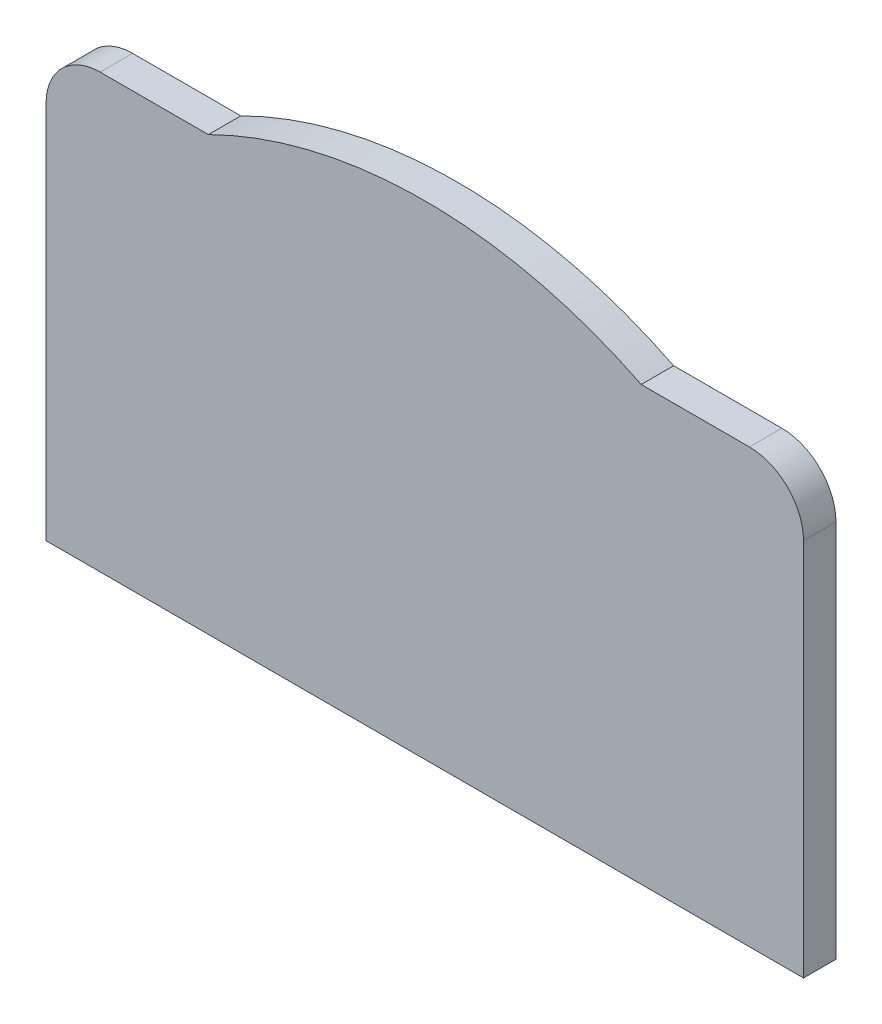
ISO-10303-21;
HEADER;
FILE_DESCRIPTION(('STEP AP214'),'2;1');
FILE_NAME('part.step','',(''),(''),'','','');
FILE_SCHEMA(('AUTOMOTIVE_DESIGN { 1 0 10303 214 1 1 1 1 }'));
ENDSEC;
DATA;
#1=APPLICATION_CONTEXT('core data for automotive mechanical design processes');
#2=APPLICATION_PROTOCOL_DEFINITION('international standard','automotive_design',2000,#1);
#3=PRODUCT_CONTEXT('',#1,'mechanical');
#4=PRODUCT('Part','Part','',(#3));
#5=PRODUCT_RELATED_PRODUCT_CATEGORY('part','',(#4));
#6=PRODUCT_DEFINITION_FORMATION('','',#4);
#7=PRODUCT_DEFINITION_CONTEXT('part definition',#1,'design');
#8=PRODUCT_DEFINITION('design','',#6,#7);
#9=PRODUCT_DEFINITION_SHAPE('','',#8);
#10=(LENGTH_UNIT() NAMED_UNIT(*) SI_UNIT(.MILLI.,.METRE.));
#11=(NAMED_UNIT(*) PLANE_ANGLE_UNIT() SI_UNIT($,.RADIAN.));
#12=(NAMED_UNIT(*) SI_UNIT($,.STERADIAN.) SOLID_ANGLE_UNIT());
#13=UNCERTAINTY_MEASURE_WITH_UNIT(LENGTH_MEASURE(1.E-05),#10,'distance_accuracy_value','');
#14=(GEOMETRIC_REPRESENTATION_CONTEXT(3) GLOBAL_UNCERTAINTY_ASSIGNED_CONTEXT((#13)) GLOBAL_UNIT_ASSIGNED_CONTEXT((#10,
#11,#12)) REPRESENTATION_CONTEXT('',''));
#15=CARTESIAN_POINT('',(0.,0.,0.));
#16=DIRECTION('',(0.,0.,1.));
#17=DIRECTION('',(1.,0.,0.));
#18=AXIS2_PLACEMENT_3D('',#15,#16,#17);
#19=CARTESIAN_POINT('',(-60.,40.,6.));
#20=DIRECTION('',(0.,-1.,0.));
#21=DIRECTION('',(0.,0.,-1.));
#22=AXIS2_PLACEMENT_3D('',#19,#20,#21);
#23=PLANE('',#22);
#24=DIRECTION('',(-1.,0.,0.));
#25=VECTOR('',#24,1.);
#26=CARTESIAN_POINT('',(-60.,40.,6.));
#27=LINE('',#26,#25);
#28=CARTESIAN_POINT('',(-30.,40.,6.));
#29=VERTEX_POINT('',#28);
#30=CARTESIAN_POINT('',(-50.,40.,6.));
#31=VERTEX_POINT('',#30);
#32=EDGE_CURVE('E46',#29,#31,#27,.T.);
#33=ORIENTED_EDGE('',*,*,#32,.F.);
#34=DIRECTION('',(0.,0.,-1.));
#35=VECTOR('',#34,1.);
#36=CARTESIAN_POINT('',(-30.,40.,6.));
#37=LINE('',#36,#35);
#38=CARTESIAN_POINT('',(-30.,40.,0.));
#39=VERTEX_POINT('',#38);
#40=EDGE_CURVE('E108',#29,#39,#37,.T.);
#41=ORIENTED_EDGE('',*,*,#40,.T.);
#42=DIRECTION('',(-1.,0.,0.));
#43=VECTOR('',#42,1.);
#44=CARTESIAN_POINT('',(-60.,40.,0.));
#45=LINE('',#44,#43);
#46=CARTESIAN_POINT('',(-50.,40.,0.));
#47=VERTEX_POINT('',#46);
#48=EDGE_CURVE('E97',#39,#47,#45,.T.);
#49=ORIENTED_EDGE('',*,*,#48,.T.);
#50=DIRECTION('',(0.,0.,-1.));
#51=VECTOR('',#50,1.);
#52=CARTESIAN_POINT('',(-50.,40.,6.));
#53=LINE('',#52,#51);
#54=EDGE_CURVE('E149',#47,#31,#53,.F.);
#55=ORIENTED_EDGE('',*,*,#54,.T.);
#56=EDGE_LOOP('',(#33,#41,#49,#55));
#57=FACE_BOUND('',#56,.T.);
#58=ADVANCED_FACE('F31',(#57),#23,.F.);
#59=CARTESIAN_POINT('',(-60.,40.,6.));
#60=DIRECTION('',(1.,0.,0.));
#61=DIRECTION('',(0.,0.,-1.));
#62=AXIS2_PLACEMENT_3D('',#59,#60,#61);
#63=PLANE('',#62);
#64=DIRECTION('',(0.,-1.,0.));
#65=VECTOR('',#64,1.);
#66=CARTESIAN_POINT('',(-60.,40.,6.));
#67=LINE('',#66,#65);
#68=CARTESIAN_POINT('',(-60.,30.,6.));
#69=VERTEX_POINT('',#68);
#70=CARTESIAN_POINT('',(-60.,-40.,6.));
#71=VERTEX_POINT('',#70);
#72=EDGE_CURVE('E125',#69,#71,#67,.T.);
#73=ORIENTED_EDGE('',*,*,#72,.F.);
#74=DIRECTION('',(0.,0.,-1.));
#75=VECTOR('',#74,1.);
#76=CARTESIAN_POINT('',(-60.,30.,6.));
#77=LINE('',#76,#75);
#78=CARTESIAN_POINT('',(-60.,30.,0.));
#79=VERTEX_POINT('',#78);
#80=EDGE_CURVE('E140',#69,#79,#77,.T.);
#81=ORIENTED_EDGE('',*,*,#80,.T.);
#82=DIRECTION('',(0.,-1.,0.));
#83=VECTOR('',#82,1.);
#84=CARTESIAN_POINT('',(-60.,40.,0.));
#85=LINE('',#84,#83);
#86=CARTESIAN_POINT('',(-60.,-40.,0.));
#87=VERTEX_POINT('',#86);
#88=EDGE_CURVE('E112',#79,#87,#85,.T.);
#89=ORIENTED_EDGE('',*,*,#88,.T.);
#90=DIRECTION('',(0.,0.,-1.));
#91=VECTOR('',#90,1.);
#92=CARTESIAN_POINT('',(-60.,-40.,6.));
#93=LINE('',#92,#91);
#94=EDGE_CURVE('E137',#71,#87,#93,.T.);
#95=ORIENTED_EDGE('',*,*,#94,.F.);
#96=EDGE_LOOP('',(#73,#81,#89,#95));
#97=FACE_BOUND('',#96,.T.);
#98=ADVANCED_FACE('F33',(#97),#63,.F.);
#99=CARTESIAN_POINT('',(-60.,-40.,6.));
#100=DIRECTION('',(0.,1.,0.));
#101=DIRECTION('',(0.,0.,1.));
#102=AXIS2_PLACEMENT_3D('',#99,#100,#101);
#103=PLANE('',#102);
#104=DIRECTION('',(1.,0.,0.));
#105=VECTOR('',#104,1.);
#106=CARTESIAN_POINT('',(-60.,-40.,0.));
#107=LINE('',#106,#105);
#108=CARTESIAN_POINT('',(80.,-40.,0.));
#109=VERTEX_POINT('',#108);
#110=EDGE_CURVE('E121',#87,#109,#107,.T.);
#111=ORIENTED_EDGE('',*,*,#110,.T.);
#112=DIRECTION('',(0.,0.,-1.));
#113=VECTOR('',#112,1.);
#114=CARTESIAN_POINT('',(80.,-40.,6.));
#115=LINE('',#114,#113);
#116=CARTESIAN_POINT('',(80.,-40.,6.));
#117=VERTEX_POINT('',#116);
#118=EDGE_CURVE('E134',#117,#109,#115,.T.);
#119=ORIENTED_EDGE('',*,*,#118,.F.);
#120=DIRECTION('',(1.,0.,0.));
#121=VECTOR('',#120,1.);
#122=CARTESIAN_POINT('',(-60.,-40.,6.));
#123=LINE('',#122,#121);
#124=EDGE_CURVE('E127',#71,#117,#123,.T.);
#125=ORIENTED_EDGE('',*,*,#124,.F.);
#126=ORIENTED_EDGE('',*,*,#94,.T.);
#127=EDGE_LOOP('',(#111,#119,#125,#126));
#128=FACE_BOUND('',#127,.T.);
#129=ADVANCED_FACE('F178',(#128),#103,.F.);
#130=CARTESIAN_POINT('',(80.,40.,6.));
#131=DIRECTION('',(-1.,0.,0.));
#132=DIRECTION('',(0.,-1.,0.));
#133=AXIS2_PLACEMENT_3D('',#130,#131,#132);
#134=PLANE('',#133);
#135=DIRECTION('',(0.,1.,0.));
#136=VECTOR('',#135,1.);
#137=CARTESIAN_POINT('',(80.,40.,0.));
#138=LINE('',#137,#136);
#139=CARTESIAN_POINT('',(80.,30.,0.));
#140=VERTEX_POINT('',#139);
#141=EDGE_CURVE('E106',#109,#140,#138,.T.);
#142=ORIENTED_EDGE('',*,*,#141,.T.);
#143=DIRECTION('',(0.,0.,-1.));
#144=VECTOR('',#143,1.);
#145=CARTESIAN_POINT('',(80.,30.,6.));
#146=LINE('',#145,#144);
#147=CARTESIAN_POINT('',(80.,30.,6.));
#148=VERTEX_POINT('',#147);
#149=EDGE_CURVE('E11',#140,#148,#146,.F.);
#150=ORIENTED_EDGE('',*,*,#149,.T.);
#151=DIRECTION('',(0.,1.,0.));
#152=VECTOR('',#151,1.);
#153=CARTESIAN_POINT('',(80.,40.,6.));
#154=LINE('',#153,#152);
#155=EDGE_CURVE('E129',#117,#148,#154,.T.);
#156=ORIENTED_EDGE('',*,*,#155,.F.);
#157=ORIENTED_EDGE('',*,*,#118,.T.);
#158=EDGE_LOOP('',(#142,#150,#156,#157));
#159=FACE_BOUND('',#158,.T.);
#160=ADVANCED_FACE('F182',(#159),#134,.F.);
#161=CARTESIAN_POINT('',(70.,40.,0.));
#162=VERTEX_POINT('',#161);
#163=CARTESIAN_POINT('',(50.,40.,0.));
#164=VERTEX_POINT('',#163);
#165=EDGE_CURVE('E105',#162,#164,#45,.T.);
#166=ORIENTED_EDGE('',*,*,#165,.T.);
#167=DIRECTION('',(0.,0.,-1.));
#168=VECTOR('',#167,1.);
#169=CARTESIAN_POINT('',(50.,40.,6.));
#170=LINE('',#169,#168);
#171=CARTESIAN_POINT('',(50.,40.,6.));
#172=VERTEX_POINT('',#171);
#173=EDGE_CURVE('E54',#172,#164,#170,.T.);
#174=ORIENTED_EDGE('',*,*,#173,.F.);
#175=CARTESIAN_POINT('',(70.,40.,6.));
#176=VERTEX_POINT('',#175);
#177=EDGE_CURVE('E132',#176,#172,#27,.T.);
#178=ORIENTED_EDGE('',*,*,#177,.F.);
#179=DIRECTION('',(0.,0.,-1.));
#180=VECTOR('',#179,1.);
#181=CARTESIAN_POINT('',(70.,40.,6.));
#182=LINE('',#181,#180);
#183=EDGE_CURVE('E146',#176,#162,#182,.T.);
#184=ORIENTED_EDGE('',*,*,#183,.T.);
#185=EDGE_LOOP('',(#166,#174,#178,#184));
#186=FACE_BOUND('',#185,.T.);
#187=ADVANCED_FACE('F174',(#186),#23,.F.);
#188=CARTESIAN_POINT('',(-60.,-40.,6.));
#189=DIRECTION('',(0.,0.,1.));
#190=DIRECTION('',(1.,0.,0.));
#191=AXIS2_PLACEMENT_3D('',#188,#189,#190);
#192=PLANE('',#191);
#193=ORIENTED_EDGE('',*,*,#177,.T.);
#194=CARTESIAN_POINT('',(10.,-40.2366607135671,6.));
#195=DIRECTION('',(0.,0.,-1.));
#196=DIRECTION('',(-1.,0.,0.));
#197=AXIS2_PLACEMENT_3D('',#194,#195,#196);
#198=CIRCLE('',#197,89.6544573485562);
#199=EDGE_CURVE('E115',#29,#172,#198,.T.);
#200=ORIENTED_EDGE('',*,*,#199,.F.);
#201=ORIENTED_EDGE('',*,*,#32,.T.);
#202=CARTESIAN_POINT('',(-50.,30.,6.));
#203=DIRECTION('',(0.,0.,1.));
#204=DIRECTION('',(1.,0.,0.));
#205=AXIS2_PLACEMENT_3D('',#202,#203,#204);
#206=CIRCLE('',#205,10.);
#207=EDGE_CURVE('E39',#31,#69,#206,.T.);
#208=ORIENTED_EDGE('',*,*,#207,.T.);
#209=ORIENTED_EDGE('',*,*,#72,.T.);
#210=ORIENTED_EDGE('',*,*,#124,.T.);
#211=ORIENTED_EDGE('',*,*,#155,.T.);
#212=CARTESIAN_POINT('',(70.,30.,6.));
#213=DIRECTION('',(0.,0.,1.));
#214=DIRECTION('',(1.,0.,0.));
#215=AXIS2_PLACEMENT_3D('',#212,#213,#214);
#216=CIRCLE('',#215,10.);
#217=EDGE_CURVE('E151',#148,#176,#216,.T.);
#218=ORIENTED_EDGE('',*,*,#217,.T.);
#219=EDGE_LOOP('',(#193,#200,#201,#208,#209,#210,#211,#218));
#220=FACE_BOUND('',#219,.T.);
#221=ADVANCED_FACE('F155',(#220),#192,.T.);
#222=CARTESIAN_POINT('',(-60.,-40.,0.));
#223=DIRECTION('',(0.,0.,1.));
#224=DIRECTION('',(1.,0.,0.));
#225=AXIS2_PLACEMENT_3D('',#222,#223,#224);
#226=PLANE('',#225);
#227=ORIENTED_EDGE('',*,*,#88,.F.);
#228=CARTESIAN_POINT('',(-50.,30.,0.));
#229=DIRECTION('',(0.,0.,1.));
#230=DIRECTION('',(1.,0.,0.));
#231=AXIS2_PLACEMENT_3D('',#228,#229,#230);
#232=CIRCLE('',#231,10.);
#233=EDGE_CURVE('E103',#79,#47,#232,.F.);
#234=ORIENTED_EDGE('',*,*,#233,.T.);
#235=ORIENTED_EDGE('',*,*,#48,.F.);
#236=CARTESIAN_POINT('',(10.,-40.2366607135671,0.));
#237=DIRECTION('',(0.,0.,-1.));
#238=DIRECTION('',(-1.,0.,0.));
#239=AXIS2_PLACEMENT_3D('',#236,#237,#238);
#240=CIRCLE('',#239,89.6544573485562);
#241=EDGE_CURVE('E102',#39,#164,#240,.T.);
#242=ORIENTED_EDGE('',*,*,#241,.T.);
#243=ORIENTED_EDGE('',*,*,#165,.F.);
#244=CARTESIAN_POINT('',(70.,30.,0.));
#245=DIRECTION('',(0.,0.,1.));
#246=DIRECTION('',(1.,0.,0.));
#247=AXIS2_PLACEMENT_3D('',#244,#245,#246);
#248=CIRCLE('',#247,10.);
#249=EDGE_CURVE('E143',#162,#140,#248,.F.);
#250=ORIENTED_EDGE('',*,*,#249,.T.);
#251=ORIENTED_EDGE('',*,*,#141,.F.);
#252=ORIENTED_EDGE('',*,*,#110,.F.);
#253=EDGE_LOOP('',(#227,#234,#235,#242,#243,#250,#251,#252));
#254=FACE_BOUND('',#253,.T.);
#255=ADVANCED_FACE('F99',(#254),#226,.F.);
#256=CARTESIAN_POINT('',(-50.,30.,6.));
#257=DIRECTION('',(0.,0.,-1.));
#258=DIRECTION('',(-1.,0.,0.));
#259=AXIS2_PLACEMENT_3D('',#256,#257,#258);
#260=CYLINDRICAL_SURFACE('',#259,10.);
#261=ORIENTED_EDGE('',*,*,#207,.F.);
#262=ORIENTED_EDGE('',*,*,#54,.F.);
#263=ORIENTED_EDGE('',*,*,#233,.F.);
#264=ORIENTED_EDGE('',*,*,#80,.F.);
#265=EDGE_LOOP('',(#261,#262,#263,#264));
#266=FACE_BOUND('',#265,.T.);
#267=ADVANCED_FACE('F161',(#266),#260,.T.);
#268=CARTESIAN_POINT('',(70.,30.,6.));
#269=DIRECTION('',(0.,0.,-1.));
#270=DIRECTION('',(-1.,0.,0.));
#271=AXIS2_PLACEMENT_3D('',#268,#269,#270);
#272=CYLINDRICAL_SURFACE('',#271,10.);
#273=ORIENTED_EDGE('',*,*,#217,.F.);
#274=ORIENTED_EDGE('',*,*,#149,.F.);
#275=ORIENTED_EDGE('',*,*,#249,.F.);
#276=ORIENTED_EDGE('',*,*,#183,.F.);
#277=EDGE_LOOP('',(#273,#274,#275,#276));
#278=FACE_BOUND('',#277,.T.);
#279=ADVANCED_FACE('F163',(#278),#272,.T.);
#280=CARTESIAN_POINT('',(10.,-40.2366607135671,6.));
#281=DIRECTION('',(0.,0.,-1.));
#282=DIRECTION('',(-1.,0.,0.));
#283=AXIS2_PLACEMENT_3D('',#280,#281,#282);
#284=CYLINDRICAL_SURFACE('',#283,89.6544573485562);
#285=ORIENTED_EDGE('',*,*,#241,.F.);
#286=ORIENTED_EDGE('',*,*,#40,.F.);
#287=ORIENTED_EDGE('',*,*,#199,.T.);
#288=ORIENTED_EDGE('',*,*,#173,.T.);
#289=EDGE_LOOP('',(#285,#286,#287,#288));
#290=FACE_BOUND('',#289,.T.);
#291=ADVANCED_FACE('F114',(#290),#284,.T.);
#292=CLOSED_SHELL('',(#58,#98,#129,#160,#187,#221,#255,#267,#279,#291));
#293=MANIFOLD_SOLID_BREP('B2',#292);
#294=ADVANCED_BREP_SHAPE_REPRESENTATION('',(#18,#293),#14);
#295=SHAPE_DEFINITION_REPRESENTATION(#9,#294);
ENDSEC;
END-ISO-10303-21;
